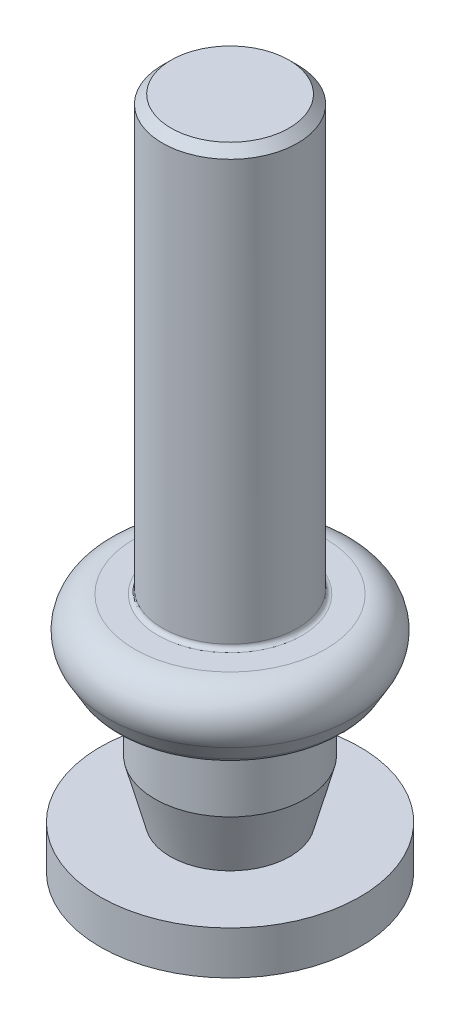
ISO-10303-21;
HEADER;
FILE_DESCRIPTION(('STEP AP214'),'2;1');
FILE_NAME('part.step','',(''),(''),'','','');
FILE_SCHEMA(('AUTOMOTIVE_DESIGN { 1 0 10303 214 1 1 1 1 }'));
ENDSEC;
DATA;
#1=APPLICATION_CONTEXT('core data for automotive mechanical design processes');
#2=APPLICATION_PROTOCOL_DEFINITION('international standard','automotive_design',2000,#1);
#3=PRODUCT_CONTEXT('',#1,'mechanical');
#4=PRODUCT('Part','Part','',(#3));
#5=PRODUCT_RELATED_PRODUCT_CATEGORY('part','',(#4));
#6=PRODUCT_DEFINITION_FORMATION('','',#4);
#7=PRODUCT_DEFINITION_CONTEXT('part definition',#1,'design');
#8=PRODUCT_DEFINITION('design','',#6,#7);
#9=PRODUCT_DEFINITION_SHAPE('','',#8);
#10=(LENGTH_UNIT() NAMED_UNIT(*) SI_UNIT(.MILLI.,.METRE.));
#11=(NAMED_UNIT(*) PLANE_ANGLE_UNIT() SI_UNIT($,.RADIAN.));
#12=(NAMED_UNIT(*) SI_UNIT($,.STERADIAN.) SOLID_ANGLE_UNIT());
#13=UNCERTAINTY_MEASURE_WITH_UNIT(LENGTH_MEASURE(1.E-05),#10,'distance_accuracy_value','');
#14=(GEOMETRIC_REPRESENTATION_CONTEXT(3) GLOBAL_UNCERTAINTY_ASSIGNED_CONTEXT((#13)) GLOBAL_UNIT_ASSIGNED_CONTEXT((#10,
#11,#12)) REPRESENTATION_CONTEXT('',''));
#15=CARTESIAN_POINT('',(0.,0.,0.));
#16=DIRECTION('',(0.,0.,1.));
#17=DIRECTION('',(1.,0.,0.));
#18=AXIS2_PLACEMENT_3D('',#15,#16,#17);
#19=CARTESIAN_POINT('',(0.,4.064,0.));
#20=DIRECTION('',(0.,1.,0.));
#21=DIRECTION('',(0.,0.,1.));
#22=AXIS2_PLACEMENT_3D('',#19,#20,#21);
#23=PLANE('',#22);
#24=CARTESIAN_POINT('',(0.,4.064,0.));
#25=DIRECTION('',(0.,1.,0.));
#26=DIRECTION('',(0.,0.,1.));
#27=AXIS2_PLACEMENT_3D('',#24,#25,#26);
#28=CIRCLE('',#27,4.22275);
#29=CARTESIAN_POINT('',(0.,4.064,4.22275));
#30=VERTEX_POINT('',#29);
#31=EDGE_CURVE('E43',#30,#30,#28,.F.);
#32=ORIENTED_EDGE('',*,*,#31,.T.);
#33=EDGE_LOOP('',(#32));
#34=FACE_BOUND('',#33,.T.);
#35=CARTESIAN_POINT('',(0.,4.064,0.));
#36=DIRECTION('',(0.,1.,0.));
#37=DIRECTION('',(0.,0.,1.));
#38=AXIS2_PLACEMENT_3D('',#35,#36,#37);
#39=CIRCLE('',#38,5.6072237917149);
#40=CARTESIAN_POINT('',(0.,4.064,5.6072237917149));
#41=VERTEX_POINT('',#40);
#42=EDGE_CURVE('E46',#41,#41,#39,.T.);
#43=ORIENTED_EDGE('',*,*,#42,.T.);
#44=EDGE_LOOP('',(#43));
#45=FACE_BOUND('',#44,.T.);
#46=ADVANCED_FACE('F14',(#34,#45),#23,.T.);
#47=CARTESIAN_POINT('',(0.,2.24382954743875,0.));
#48=DIRECTION('',(0.,1.,0.));
#49=DIRECTION('',(0.,0.,1.));
#50=AXIS2_PLACEMENT_3D('',#47,#48,#49);
#51=TOROIDAL_SURFACE('',#50,5.6072237917149,1.82017045256125);
#52=CARTESIAN_POINT('',(0.,1.33374432115813,0.));
#53=DIRECTION('',(0.,1.,0.));
#54=DIRECTION('',(0.,0.,1.));
#55=AXIS2_PLACEMENT_3D('',#52,#53,#54);
#56=CIRCLE('',#55,7.18353764285077);
#57=CARTESIAN_POINT('',(0.,1.33374432115813,7.18353764285077));
#58=VERTEX_POINT('',#57);
#59=EDGE_CURVE('E49',#58,#58,#56,.T.);
#60=ORIENTED_EDGE('',*,*,#59,.T.);
#61=EDGE_LOOP('',(#60));
#62=FACE_BOUND('',#61,.T.);
#63=ORIENTED_EDGE('',*,*,#42,.F.);
#64=EDGE_LOOP('',(#63));
#65=FACE_BOUND('',#64,.T.);
#66=ADVANCED_FACE('F84',(#62,#65),#51,.T.);
#67=CARTESIAN_POINT('',(0.,1.33374432115813,0.));
#68=DIRECTION('',(0.,1.,0.));
#69=DIRECTION('',(0.,0.,1.));
#70=AXIS2_PLACEMENT_3D('',#67,#68,#69);
#71=CONICAL_SURFACE('',#70,7.18353764285077,0.523598775598293);
#72=CARTESIAN_POINT('',(0.,0.381000000000005,0.));
#73=DIRECTION('',(0.,-1.,0.));
#74=DIRECTION('',(0.,0.,-1.));
#75=AXIS2_PLACEMENT_3D('',#72,#73,#74);
#76=CIRCLE('',#75,6.63347045256125);
#77=CARTESIAN_POINT('',(0.,0.381000000000005,-6.63347045256125));
#78=VERTEX_POINT('',#77);
#79=EDGE_CURVE('E37',#78,#78,#76,.F.);
#80=ORIENTED_EDGE('',*,*,#79,.T.);
#81=EDGE_LOOP('',(#80));
#82=FACE_BOUND('',#81,.T.);
#83=ORIENTED_EDGE('',*,*,#59,.F.);
#84=EDGE_LOOP('',(#83));
#85=FACE_BOUND('',#84,.T.);
#86=ADVANCED_FACE('F91',(#82,#85),#71,.T.);
#87=CARTESIAN_POINT('',(0.,0.,0.));
#88=DIRECTION('',(0.,-1.,0.));
#89=DIRECTION('',(0.,0.,-1.));
#90=AXIS2_PLACEMENT_3D('',#87,#88,#89);
#91=PLANE('',#90);
#92=CARTESIAN_POINT('',(0.,0.,0.));
#93=DIRECTION('',(0.,-1.,0.));
#94=DIRECTION('',(0.,0.,-1.));
#95=AXIS2_PLACEMENT_3D('',#92,#93,#94);
#96=CIRCLE('',#95,4.8006);
#97=CARTESIAN_POINT('',(0.,0.,-4.8006));
#98=VERTEX_POINT('',#97);
#99=EDGE_CURVE('E25',#98,#98,#96,.F.);
#100=ORIENTED_EDGE('',*,*,#99,.T.);
#101=EDGE_LOOP('',(#100));
#102=FACE_BOUND('',#101,.T.);
#103=CARTESIAN_POINT('',(0.,0.,0.));
#104=DIRECTION('',(0.,-1.,0.));
#105=DIRECTION('',(0.,0.,-1.));
#106=AXIS2_PLACEMENT_3D('',#103,#104,#105);
#107=CIRCLE('',#106,5.9735590948775);
#108=CARTESIAN_POINT('',(0.,0.,-5.9735590948775));
#109=VERTEX_POINT('',#108);
#110=EDGE_CURVE('E34',#109,#109,#107,.T.);
#111=ORIENTED_EDGE('',*,*,#110,.T.);
#112=EDGE_LOOP('',(#111));
#113=FACE_BOUND('',#112,.T.);
#114=ADVANCED_FACE('F134',(#102,#113),#91,.T.);
#115=CARTESIAN_POINT('',(-3.96875000000001,29.464,0.));
#116=DIRECTION('',(0.,-1.,0.));
#117=DIRECTION('',(0.,0.,-1.));
#118=AXIS2_PLACEMENT_3D('',#115,#116,#117);
#119=PLANE('',#118);
#120=CARTESIAN_POINT('',(0.,29.464,0.));
#121=DIRECTION('',(0.,-1.,0.));
#122=DIRECTION('',(0.,0.,-1.));
#123=AXIS2_PLACEMENT_3D('',#120,#121,#122);
#124=CIRCLE('',#123,3.46075);
#125=CARTESIAN_POINT('',(0.,29.464,-3.46075));
#126=VERTEX_POINT('',#125);
#127=EDGE_CURVE('E10',#126,#126,#124,.F.);
#128=ORIENTED_EDGE('',*,*,#127,.T.);
#129=EDGE_LOOP('',(#128));
#130=FACE_BOUND('',#129,.T.);
#131=ADVANCED_FACE('F131',(#130),#119,.F.);
#132=CARTESIAN_POINT('',(0.,0.,0.));
#133=DIRECTION('',(0.,-1.,0.));
#134=DIRECTION('',(0.,0.,-1.));
#135=AXIS2_PLACEMENT_3D('',#132,#133,#134);
#136=CYLINDRICAL_SURFACE('',#135,3.96875);
#137=CARTESIAN_POINT('',(0.,28.956,0.));
#138=DIRECTION('',(0.,-1.,0.));
#139=DIRECTION('',(0.,0.,-1.));
#140=AXIS2_PLACEMENT_3D('',#137,#138,#139);
#141=CIRCLE('',#140,3.96875);
#142=CARTESIAN_POINT('',(0.,28.956,-3.96875));
#143=VERTEX_POINT('',#142);
#144=EDGE_CURVE('E21',#143,#143,#141,.T.);
#145=ORIENTED_EDGE('',*,*,#144,.T.);
#146=EDGE_LOOP('',(#145));
#147=FACE_BOUND('',#146,.T.);
#148=CARTESIAN_POINT('',(0.,4.318,0.));
#149=DIRECTION('',(0.,1.,0.));
#150=DIRECTION('',(0.,0.,1.));
#151=AXIS2_PLACEMENT_3D('',#148,#149,#150);
#152=CIRCLE('',#151,3.96875);
#153=CARTESIAN_POINT('',(0.,4.318,3.96875));
#154=VERTEX_POINT('',#153);
#155=EDGE_CURVE('E40',#154,#154,#152,.T.);
#156=ORIENTED_EDGE('',*,*,#155,.T.);
#157=EDGE_LOOP('',(#156));
#158=FACE_BOUND('',#157,.T.);
#159=ADVANCED_FACE('F117',(#147,#158),#136,.T.);
#160=CARTESIAN_POINT('',(0.,0.,0.));
#161=DIRECTION('',(0.,1.,0.));
#162=DIRECTION('',(0.,0.,1.));
#163=AXIS2_PLACEMENT_3D('',#160,#161,#162);
#164=CYLINDRICAL_SURFACE('',#163,4.4196);
#165=CARTESIAN_POINT('',(0.,-0.381,0.));
#166=DIRECTION('',(0.,-1.,0.));
#167=DIRECTION('',(0.,0.,-1.));
#168=AXIS2_PLACEMENT_3D('',#165,#166,#167);
#169=CIRCLE('',#168,4.4196);
#170=CARTESIAN_POINT('',(0.,-0.381,-4.4196));
#171=VERTEX_POINT('',#170);
#172=EDGE_CURVE('E29',#171,#171,#169,.T.);
#173=ORIENTED_EDGE('',*,*,#172,.T.);
#174=EDGE_LOOP('',(#173));
#175=FACE_BOUND('',#174,.T.);
#176=CARTESIAN_POINT('',(0.,-4.1402,0.));
#177=DIRECTION('',(0.,1.,0.));
#178=DIRECTION('',(0.,0.,1.));
#179=AXIS2_PLACEMENT_3D('',#176,#177,#178);
#180=CIRCLE('',#179,4.4196);
#181=CARTESIAN_POINT('',(0.,-4.1402,4.4196));
#182=VERTEX_POINT('',#181);
#183=EDGE_CURVE('E52',#182,#182,#180,.T.);
#184=ORIENTED_EDGE('',*,*,#183,.T.);
#185=EDGE_LOOP('',(#184));
#186=FACE_BOUND('',#185,.T.);
#187=ADVANCED_FACE('F114',(#175,#186),#164,.T.);
#188=CARTESIAN_POINT('',(0.,-4.1402,0.));
#189=DIRECTION('',(0.,1.,0.));
#190=DIRECTION('',(0.,0.,1.));
#191=AXIS2_PLACEMENT_3D('',#188,#189,#190);
#192=CONICAL_SURFACE('',#191,4.4196,0.261799387799151);
#193=CARTESIAN_POINT('',(0.,-7.5187577110022,0.));
#194=DIRECTION('',(0.,1.,0.));
#195=DIRECTION('',(0.,0.,1.));
#196=AXIS2_PLACEMENT_3D('',#193,#194,#195);
#197=CIRCLE('',#196,3.51431818975501);
#198=CARTESIAN_POINT('',(0.,-7.5187577110022,3.51431818975501));
#199=VERTEX_POINT('',#198);
#200=EDGE_CURVE('E55',#199,#199,#197,.F.);
#201=ORIENTED_EDGE('',*,*,#200,.F.);
#202=EDGE_LOOP('',(#201));
#203=FACE_BOUND('',#202,.T.);
#204=ORIENTED_EDGE('',*,*,#183,.F.);
#205=EDGE_LOOP('',(#204));
#206=FACE_BOUND('',#205,.T.);
#207=ADVANCED_FACE('F101',(#203,#206),#192,.T.);
#208=CARTESIAN_POINT('',(0.,4.318,0.));
#209=DIRECTION('',(0.,1.,0.));
#210=DIRECTION('',(0.,0.,1.));
#211=AXIS2_PLACEMENT_3D('',#208,#209,#210);
#212=TOROIDAL_SURFACE('',#211,4.22275,0.254);
#213=ORIENTED_EDGE('',*,*,#155,.F.);
#214=EDGE_LOOP('',(#213));
#215=FACE_BOUND('',#214,.T.);
#216=ORIENTED_EDGE('',*,*,#31,.F.);
#217=EDGE_LOOP('',(#216));
#218=FACE_BOUND('',#217,.T.);
#219=ADVANCED_FACE('F97',(#215,#218),#212,.F.);
#220=CARTESIAN_POINT('',(0.,0.762,0.));
#221=DIRECTION('',(0.,-1.,0.));
#222=DIRECTION('',(0.,0.,-1.));
#223=AXIS2_PLACEMENT_3D('',#220,#221,#222);
#224=TOROIDAL_SURFACE('',#223,5.9735590948775,0.762);
#225=ORIENTED_EDGE('',*,*,#110,.F.);
#226=EDGE_LOOP('',(#225));
#227=FACE_BOUND('',#226,.T.);
#228=ORIENTED_EDGE('',*,*,#79,.F.);
#229=EDGE_LOOP('',(#228));
#230=FACE_BOUND('',#229,.T.);
#231=ADVANCED_FACE('F100',(#227,#230),#224,.T.);
#232=CARTESIAN_POINT('',(0.,-0.381,0.));
#233=DIRECTION('',(0.,-1.,0.));
#234=DIRECTION('',(0.,0.,-1.));
#235=AXIS2_PLACEMENT_3D('',#232,#233,#234);
#236=TOROIDAL_SURFACE('',#235,4.8006,0.381);
#237=ORIENTED_EDGE('',*,*,#99,.F.);
#238=EDGE_LOOP('',(#237));
#239=FACE_BOUND('',#238,.T.);
#240=ORIENTED_EDGE('',*,*,#172,.F.);
#241=EDGE_LOOP('',(#240));
#242=FACE_BOUND('',#241,.T.);
#243=ADVANCED_FACE('F80',(#239,#242),#236,.F.);
#244=CARTESIAN_POINT('',(-7.62,-10.0587577110022,0.));
#245=DIRECTION('',(0.,-1.,0.));
#246=DIRECTION('',(0.,0.,-1.));
#247=AXIS2_PLACEMENT_3D('',#244,#245,#246);
#248=PLANE('',#247);
#249=CARTESIAN_POINT('',(0.,-10.0587577110022,0.));
#250=DIRECTION('',(0.,1.,0.));
#251=DIRECTION('',(0.,0.,1.));
#252=AXIS2_PLACEMENT_3D('',#249,#250,#251);
#253=CIRCLE('',#252,7.62);
#254=CARTESIAN_POINT('',(0.,-10.0587577110022,7.62));
#255=VERTEX_POINT('',#254);
#256=EDGE_CURVE('E58',#255,#255,#253,.T.);
#257=ORIENTED_EDGE('',*,*,#256,.F.);
#258=EDGE_LOOP('',(#257));
#259=FACE_BOUND('',#258,.T.);
#260=ADVANCED_FACE('F69',(#259),#248,.T.);
#261=CARTESIAN_POINT('',(0.,0.,0.));
#262=DIRECTION('',(0.,1.,0.));
#263=DIRECTION('',(0.,0.,1.));
#264=AXIS2_PLACEMENT_3D('',#261,#262,#263);
#265=CYLINDRICAL_SURFACE('',#264,7.62);
#266=ORIENTED_EDGE('',*,*,#256,.T.);
#267=EDGE_LOOP('',(#266));
#268=FACE_BOUND('',#267,.T.);
#269=CARTESIAN_POINT('',(0.,-7.5187577110022,0.));
#270=DIRECTION('',(0.,1.,0.));
#271=DIRECTION('',(0.,0.,1.));
#272=AXIS2_PLACEMENT_3D('',#269,#270,#271);
#273=CIRCLE('',#272,7.62);
#274=CARTESIAN_POINT('',(0.,-7.5187577110022,7.62));
#275=VERTEX_POINT('',#274);
#276=EDGE_CURVE('E61',#275,#275,#273,.T.);
#277=ORIENTED_EDGE('',*,*,#276,.F.);
#278=EDGE_LOOP('',(#277));
#279=FACE_BOUND('',#278,.T.);
#280=ADVANCED_FACE('F67',(#268,#279),#265,.T.);
#281=CARTESIAN_POINT('',(0.,-7.5187577110022,0.));
#282=DIRECTION('',(0.,1.,0.));
#283=DIRECTION('',(0.,0.,1.));
#284=AXIS2_PLACEMENT_3D('',#281,#282,#283);
#285=PLANE('',#284);
#286=ORIENTED_EDGE('',*,*,#200,.T.);
#287=EDGE_LOOP('',(#286));
#288=FACE_BOUND('',#287,.T.);
#289=ORIENTED_EDGE('',*,*,#276,.T.);
#290=EDGE_LOOP('',(#289));
#291=FACE_BOUND('',#290,.T.);
#292=ADVANCED_FACE('F65',(#288,#291),#285,.T.);
#293=CARTESIAN_POINT('',(0.,28.956,0.));
#294=DIRECTION('',(0.,-1.,0.));
#295=DIRECTION('',(0.,0.,-1.));
#296=AXIS2_PLACEMENT_3D('',#293,#294,#295);
#297=CONICAL_SURFACE('',#296,3.96875,0.785398163397455);
#298=ORIENTED_EDGE('',*,*,#127,.F.);
#299=EDGE_LOOP('',(#298));
#300=FACE_BOUND('',#299,.T.);
#301=ORIENTED_EDGE('',*,*,#144,.F.);
#302=EDGE_LOOP('',(#301));
#303=FACE_BOUND('',#302,.T.);
#304=ADVANCED_FACE('F16',(#300,#303),#297,.T.);
#305=CLOSED_SHELL('',(#46,#66,#86,#114,#131,#159,#187,#207,#219,#231,#243,#260,#280,#292,#304));
#306=MANIFOLD_SOLID_BREP('B1',#305);
#307=ADVANCED_BREP_SHAPE_REPRESENTATION('',(#18,#306),#14);
#308=SHAPE_DEFINITION_REPRESENTATION(#9,#307);
ENDSEC;
END-ISO-10303-21;
